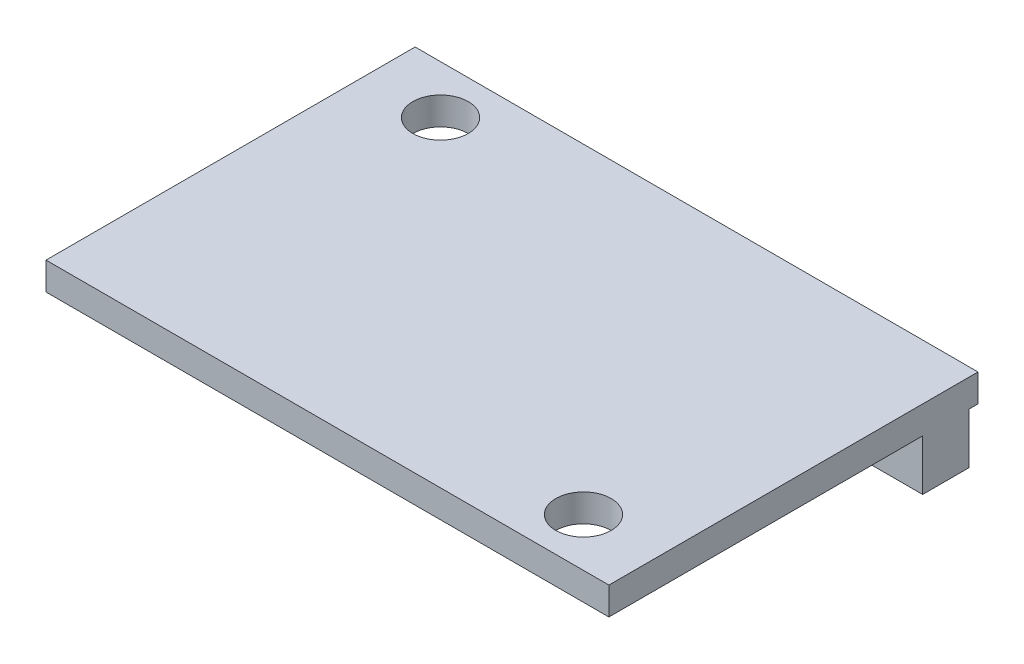
ISO-10303-21;
HEADER;
FILE_DESCRIPTION(('STEP AP214'),'2;1');
FILE_NAME('part.step','',(''),(''),'','','');
FILE_SCHEMA(('AUTOMOTIVE_DESIGN { 1 0 10303 214 1 1 1 1 }'));
ENDSEC;
DATA;
#1=APPLICATION_CONTEXT('core data for automotive mechanical design processes');
#2=APPLICATION_PROTOCOL_DEFINITION('international standard','automotive_design',2000,#1);
#3=PRODUCT_CONTEXT('',#1,'mechanical');
#4=PRODUCT('Part','Part','',(#3));
#5=PRODUCT_RELATED_PRODUCT_CATEGORY('part','',(#4));
#6=PRODUCT_DEFINITION_FORMATION('','',#4);
#7=PRODUCT_DEFINITION_CONTEXT('part definition',#1,'design');
#8=PRODUCT_DEFINITION('design','',#6,#7);
#9=PRODUCT_DEFINITION_SHAPE('','',#8);
#10=(LENGTH_UNIT() NAMED_UNIT(*) SI_UNIT(.MILLI.,.METRE.));
#11=(NAMED_UNIT(*) PLANE_ANGLE_UNIT() SI_UNIT($,.RADIAN.));
#12=(NAMED_UNIT(*) SI_UNIT($,.STERADIAN.) SOLID_ANGLE_UNIT());
#13=UNCERTAINTY_MEASURE_WITH_UNIT(LENGTH_MEASURE(1.E-05),#10,'distance_accuracy_value','');
#14=(GEOMETRIC_REPRESENTATION_CONTEXT(3) GLOBAL_UNCERTAINTY_ASSIGNED_CONTEXT((#13)) GLOBAL_UNIT_ASSIGNED_CONTEXT((#10,
#11,#12)) REPRESENTATION_CONTEXT('',''));
#15=CARTESIAN_POINT('',(0.,0.,0.));
#16=DIRECTION('',(0.,0.,1.));
#17=DIRECTION('',(1.,0.,0.));
#18=AXIS2_PLACEMENT_3D('',#15,#16,#17);
#19=CARTESIAN_POINT('',(0.,1.5,0.));
#20=DIRECTION('',(0.,-1.,0.));
#21=DIRECTION('',(0.,0.,-1.));
#22=AXIS2_PLACEMENT_3D('',#19,#20,#21);
#23=PLANE('',#22);
#24=DIRECTION('',(0.,0.,-1.));
#25=VECTOR('',#24,1.);
#26=CARTESIAN_POINT('',(15.25,1.5,10.));
#27=LINE('',#26,#25);
#28=CARTESIAN_POINT('',(15.25,1.5,10.));
#29=VERTEX_POINT('',#28);
#30=CARTESIAN_POINT('',(15.25,1.5,-10.));
#31=VERTEX_POINT('',#30);
#32=EDGE_CURVE('E151',#29,#31,#27,.T.);
#33=ORIENTED_EDGE('',*,*,#32,.T.);
#34=DIRECTION('',(-1.,0.,0.));
#35=VECTOR('',#34,1.);
#36=CARTESIAN_POINT('',(-15.25,1.5,-10.));
#37=LINE('',#36,#35);
#38=CARTESIAN_POINT('',(-15.25,1.5,-10.));
#39=VERTEX_POINT('',#38);
#40=EDGE_CURVE('E155',#31,#39,#37,.T.);
#41=ORIENTED_EDGE('',*,*,#40,.T.);
#42=DIRECTION('',(0.,0.,1.));
#43=VECTOR('',#42,1.);
#44=CARTESIAN_POINT('',(-15.25,1.5,10.));
#45=LINE('',#44,#43);
#46=CARTESIAN_POINT('',(-15.25,1.5,10.));
#47=VERTEX_POINT('',#46);
#48=EDGE_CURVE('E159',#39,#47,#45,.T.);
#49=ORIENTED_EDGE('',*,*,#48,.T.);
#50=DIRECTION('',(1.,0.,0.));
#51=VECTOR('',#50,1.);
#52=CARTESIAN_POINT('',(-15.25,1.5,10.));
#53=LINE('',#52,#51);
#54=EDGE_CURVE('E162',#47,#29,#53,.T.);
#55=ORIENTED_EDGE('',*,*,#54,.T.);
#56=EDGE_LOOP('',(#33,#41,#49,#55));
#57=FACE_BOUND('',#56,.T.);
#58=CARTESIAN_POINT('',(-11.25,1.5,-7.37704918032787));
#59=DIRECTION('',(0.,1.,0.));
#60=DIRECTION('',(0.,0.,1.));
#61=AXIS2_PLACEMENT_3D('',#58,#59,#60);
#62=CIRCLE('',#61,1.5);
#63=CARTESIAN_POINT('',(-11.25,1.5,-5.87704918032787));
#64=VERTEX_POINT('',#63);
#65=EDGE_CURVE('E143',#64,#64,#62,.T.);
#66=ORIENTED_EDGE('',*,*,#65,.F.);
#67=EDGE_LOOP('',(#66));
#68=FACE_BOUND('',#67,.T.);
#69=CARTESIAN_POINT('',(11.25,1.5,7.37704918032787));
#70=DIRECTION('',(0.,1.,0.));
#71=DIRECTION('',(0.,0.,1.));
#72=AXIS2_PLACEMENT_3D('',#69,#70,#71);
#73=CIRCLE('',#72,1.5);
#74=CARTESIAN_POINT('',(11.25,1.5,8.87704918032787));
#75=VERTEX_POINT('',#74);
#76=EDGE_CURVE('E133',#75,#75,#73,.T.);
#77=ORIENTED_EDGE('',*,*,#76,.F.);
#78=EDGE_LOOP('',(#77));
#79=FACE_BOUND('',#78,.T.);
#80=ADVANCED_FACE('F39',(#57,#68,#79),#23,.F.);
#81=CARTESIAN_POINT('',(0.,0.,0.));
#82=DIRECTION('',(0.,-1.,0.));
#83=DIRECTION('',(0.,0.,-1.));
#84=AXIS2_PLACEMENT_3D('',#81,#82,#83);
#85=PLANE('',#84);
#86=DIRECTION('',(-1.,0.,0.));
#87=VECTOR('',#86,1.);
#88=CARTESIAN_POINT('',(-6.75,0.,-7.));
#89=LINE('',#88,#87);
#90=CARTESIAN_POINT('',(15.25,0.,-7.));
#91=VERTEX_POINT('',#90);
#92=CARTESIAN_POINT('',(-6.75,0.,-7.));
#93=VERTEX_POINT('',#92);
#94=EDGE_CURVE('E124',#91,#93,#89,.T.);
#95=ORIENTED_EDGE('',*,*,#94,.F.);
#96=DIRECTION('',(0.,0.,-1.));
#97=VECTOR('',#96,1.);
#98=CARTESIAN_POINT('',(15.25,0.,10.));
#99=LINE('',#98,#97);
#100=CARTESIAN_POINT('',(15.25,0.,10.));
#101=VERTEX_POINT('',#100);
#102=EDGE_CURVE('E166',#101,#91,#99,.T.);
#103=ORIENTED_EDGE('',*,*,#102,.F.);
#104=DIRECTION('',(1.,0.,0.));
#105=VECTOR('',#104,1.);
#106=CARTESIAN_POINT('',(-15.25,0.,10.));
#107=LINE('',#106,#105);
#108=CARTESIAN_POINT('',(-15.25,0.,10.));
#109=VERTEX_POINT('',#108);
#110=EDGE_CURVE('E156',#109,#101,#107,.T.);
#111=ORIENTED_EDGE('',*,*,#110,.F.);
#112=DIRECTION('',(0.,0.,1.));
#113=VECTOR('',#112,1.);
#114=CARTESIAN_POINT('',(-15.25,0.,10.));
#115=LINE('',#114,#113);
#116=CARTESIAN_POINT('',(-15.25,0.,-10.));
#117=VERTEX_POINT('',#116);
#118=EDGE_CURVE('E173',#117,#109,#115,.T.);
#119=ORIENTED_EDGE('',*,*,#118,.F.);
#120=DIRECTION('',(-1.,0.,0.));
#121=VECTOR('',#120,1.);
#122=CARTESIAN_POINT('',(-15.25,0.,-10.));
#123=LINE('',#122,#121);
#124=CARTESIAN_POINT('',(15.25,0.,-10.));
#125=VERTEX_POINT('',#124);
#126=EDGE_CURVE('E170',#125,#117,#123,.T.);
#127=ORIENTED_EDGE('',*,*,#126,.F.);
#128=CARTESIAN_POINT('',(15.25,0.,-9.5));
#129=VERTEX_POINT('',#128);
#130=EDGE_CURVE('E147',#129,#125,#99,.T.);
#131=ORIENTED_EDGE('',*,*,#130,.F.);
#132=DIRECTION('',(1.,0.,0.));
#133=VECTOR('',#132,1.);
#134=CARTESIAN_POINT('',(-6.75,0.,-9.5));
#135=LINE('',#134,#133);
#136=CARTESIAN_POINT('',(-6.75,0.,-9.5));
#137=VERTEX_POINT('',#136);
#138=EDGE_CURVE('E60',#137,#129,#135,.T.);
#139=ORIENTED_EDGE('',*,*,#138,.F.);
#140=DIRECTION('',(0.,0.,-1.));
#141=VECTOR('',#140,1.);
#142=CARTESIAN_POINT('',(-6.75,0.,-7.));
#143=LINE('',#142,#141);
#144=EDGE_CURVE('E55',#93,#137,#143,.T.);
#145=ORIENTED_EDGE('',*,*,#144,.F.);
#146=EDGE_LOOP('',(#95,#103,#111,#119,#127,#131,#139,#145));
#147=FACE_BOUND('',#146,.T.);
#148=CARTESIAN_POINT('',(-11.25,0.,-7.37704918032787));
#149=DIRECTION('',(0.,1.,0.));
#150=DIRECTION('',(0.,0.,1.));
#151=AXIS2_PLACEMENT_3D('',#148,#149,#150);
#152=CIRCLE('',#151,1.5);
#153=CARTESIAN_POINT('',(-11.25,0.,-5.87704918032787));
#154=VERTEX_POINT('',#153);
#155=EDGE_CURVE('E141',#154,#154,#152,.T.);
#156=ORIENTED_EDGE('',*,*,#155,.T.);
#157=EDGE_LOOP('',(#156));
#158=FACE_BOUND('',#157,.T.);
#159=CARTESIAN_POINT('',(11.25,0.,7.37704918032787));
#160=DIRECTION('',(0.,1.,0.));
#161=DIRECTION('',(0.,0.,1.));
#162=AXIS2_PLACEMENT_3D('',#159,#160,#161);
#163=CIRCLE('',#162,1.5);
#164=CARTESIAN_POINT('',(11.25,0.,8.87704918032787));
#165=VERTEX_POINT('',#164);
#166=EDGE_CURVE('E128',#165,#165,#163,.T.);
#167=ORIENTED_EDGE('',*,*,#166,.T.);
#168=EDGE_LOOP('',(#167));
#169=FACE_BOUND('',#168,.T.);
#170=ADVANCED_FACE('F195',(#147,#158,#169),#85,.T.);
#171=CARTESIAN_POINT('',(15.25,1.5,10.));
#172=DIRECTION('',(-1.,0.,0.));
#173=DIRECTION('',(0.,0.,1.));
#174=AXIS2_PLACEMENT_3D('',#171,#172,#173);
#175=PLANE('',#174);
#176=ORIENTED_EDGE('',*,*,#102,.T.);
#177=DIRECTION('',(0.,1.,0.));
#178=VECTOR('',#177,1.);
#179=CARTESIAN_POINT('',(15.25,-2.75,-7.));
#180=LINE('',#179,#178);
#181=CARTESIAN_POINT('',(15.25,-2.75,-7.));
#182=VERTEX_POINT('',#181);
#183=EDGE_CURVE('E135',#182,#91,#180,.T.);
#184=ORIENTED_EDGE('',*,*,#183,.F.);
#185=DIRECTION('',(0.,0.,1.));
#186=VECTOR('',#185,1.);
#187=CARTESIAN_POINT('',(15.25,-2.75,-7.));
#188=LINE('',#187,#186);
#189=CARTESIAN_POINT('',(15.25,-2.75,-9.5));
#190=VERTEX_POINT('',#189);
#191=EDGE_CURVE('E113',#190,#182,#188,.T.);
#192=ORIENTED_EDGE('',*,*,#191,.F.);
#193=DIRECTION('',(0.,1.,0.));
#194=VECTOR('',#193,1.);
#195=CARTESIAN_POINT('',(15.25,-2.75,-9.5));
#196=LINE('',#195,#194);
#197=EDGE_CURVE('E109',#190,#129,#196,.T.);
#198=ORIENTED_EDGE('',*,*,#197,.T.);
#199=ORIENTED_EDGE('',*,*,#130,.T.);
#200=DIRECTION('',(0.,-1.,0.));
#201=VECTOR('',#200,1.);
#202=CARTESIAN_POINT('',(15.25,1.5,-10.));
#203=LINE('',#202,#201);
#204=EDGE_CURVE('E11',#31,#125,#203,.T.);
#205=ORIENTED_EDGE('',*,*,#204,.F.);
#206=ORIENTED_EDGE('',*,*,#32,.F.);
#207=DIRECTION('',(0.,-1.,0.));
#208=VECTOR('',#207,1.);
#209=CARTESIAN_POINT('',(15.25,1.5,10.));
#210=LINE('',#209,#208);
#211=EDGE_CURVE('E165',#29,#101,#210,.T.);
#212=ORIENTED_EDGE('',*,*,#211,.T.);
#213=EDGE_LOOP('',(#176,#184,#192,#198,#199,#205,#206,#212));
#214=FACE_BOUND('',#213,.T.);
#215=ADVANCED_FACE('F41',(#214),#175,.F.);
#216=CARTESIAN_POINT('',(-15.25,1.5,-10.));
#217=DIRECTION('',(0.,0.,1.));
#218=DIRECTION('',(1.,0.,0.));
#219=AXIS2_PLACEMENT_3D('',#216,#217,#218);
#220=PLANE('',#219);
#221=ORIENTED_EDGE('',*,*,#126,.T.);
#222=DIRECTION('',(0.,-1.,0.));
#223=VECTOR('',#222,1.);
#224=CARTESIAN_POINT('',(-15.25,1.5,-10.));
#225=LINE('',#224,#223);
#226=EDGE_CURVE('E48',#39,#117,#225,.T.);
#227=ORIENTED_EDGE('',*,*,#226,.F.);
#228=ORIENTED_EDGE('',*,*,#40,.F.);
#229=ORIENTED_EDGE('',*,*,#204,.T.);
#230=EDGE_LOOP('',(#221,#227,#228,#229));
#231=FACE_BOUND('',#230,.T.);
#232=ADVANCED_FACE('F209',(#231),#220,.F.);
#233=CARTESIAN_POINT('',(-15.25,1.5,10.));
#234=DIRECTION('',(1.,0.,0.));
#235=DIRECTION('',(0.,0.,-1.));
#236=AXIS2_PLACEMENT_3D('',#233,#234,#235);
#237=PLANE('',#236);
#238=ORIENTED_EDGE('',*,*,#118,.T.);
#239=DIRECTION('',(0.,-1.,0.));
#240=VECTOR('',#239,1.);
#241=CARTESIAN_POINT('',(-15.25,1.5,10.));
#242=LINE('',#241,#240);
#243=EDGE_CURVE('E181',#47,#109,#242,.T.);
#244=ORIENTED_EDGE('',*,*,#243,.F.);
#245=ORIENTED_EDGE('',*,*,#48,.F.);
#246=ORIENTED_EDGE('',*,*,#226,.T.);
#247=EDGE_LOOP('',(#238,#244,#245,#246));
#248=FACE_BOUND('',#247,.T.);
#249=ADVANCED_FACE('F190',(#248),#237,.F.);
#250=CARTESIAN_POINT('',(-15.25,1.5,10.));
#251=DIRECTION('',(0.,0.,-1.));
#252=DIRECTION('',(-1.,0.,0.));
#253=AXIS2_PLACEMENT_3D('',#250,#251,#252);
#254=PLANE('',#253);
#255=ORIENTED_EDGE('',*,*,#110,.T.);
#256=ORIENTED_EDGE('',*,*,#211,.F.);
#257=ORIENTED_EDGE('',*,*,#54,.F.);
#258=ORIENTED_EDGE('',*,*,#243,.T.);
#259=EDGE_LOOP('',(#255,#256,#257,#258));
#260=FACE_BOUND('',#259,.T.);
#261=ADVANCED_FACE('F200',(#260),#254,.F.);
#262=CARTESIAN_POINT('',(-11.25,1.5,-7.37704918032787));
#263=DIRECTION('',(0.,-1.,0.));
#264=DIRECTION('',(0.,0.,-1.));
#265=AXIS2_PLACEMENT_3D('',#262,#263,#264);
#266=CYLINDRICAL_SURFACE('',#265,1.5);
#267=ORIENTED_EDGE('',*,*,#65,.T.);
#268=EDGE_LOOP('',(#267));
#269=FACE_BOUND('',#268,.T.);
#270=ORIENTED_EDGE('',*,*,#155,.F.);
#271=EDGE_LOOP('',(#270));
#272=FACE_BOUND('',#271,.T.);
#273=ADVANCED_FACE('F223',(#269,#272),#266,.F.);
#274=CARTESIAN_POINT('',(11.25,1.5,7.37704918032787));
#275=DIRECTION('',(0.,-1.,0.));
#276=DIRECTION('',(0.,0.,-1.));
#277=AXIS2_PLACEMENT_3D('',#274,#275,#276);
#278=CYLINDRICAL_SURFACE('',#277,1.5);
#279=ORIENTED_EDGE('',*,*,#76,.T.);
#280=EDGE_LOOP('',(#279));
#281=FACE_BOUND('',#280,.T.);
#282=ORIENTED_EDGE('',*,*,#166,.F.);
#283=EDGE_LOOP('',(#282));
#284=FACE_BOUND('',#283,.T.);
#285=ADVANCED_FACE('F230',(#281,#284),#278,.F.);
#286=CARTESIAN_POINT('',(-6.75,-2.75,-7.));
#287=DIRECTION('',(1.,0.,0.));
#288=DIRECTION('',(0.,0.,-1.));
#289=AXIS2_PLACEMENT_3D('',#286,#287,#288);
#290=PLANE('',#289);
#291=ORIENTED_EDGE('',*,*,#144,.T.);
#292=DIRECTION('',(0.,1.,0.));
#293=VECTOR('',#292,1.);
#294=CARTESIAN_POINT('',(-6.75,-2.75,-9.5));
#295=LINE('',#294,#293);
#296=CARTESIAN_POINT('',(-6.75,-2.75,-9.5));
#297=VERTEX_POINT('',#296);
#298=EDGE_CURVE('E107',#297,#137,#295,.T.);
#299=ORIENTED_EDGE('',*,*,#298,.F.);
#300=DIRECTION('',(0.,0.,-1.));
#301=VECTOR('',#300,1.);
#302=CARTESIAN_POINT('',(-6.75,-2.75,-7.));
#303=LINE('',#302,#301);
#304=CARTESIAN_POINT('',(-6.75,-2.75,-7.));
#305=VERTEX_POINT('',#304);
#306=EDGE_CURVE('E114',#305,#297,#303,.T.);
#307=ORIENTED_EDGE('',*,*,#306,.F.);
#308=DIRECTION('',(0.,1.,0.));
#309=VECTOR('',#308,1.);
#310=CARTESIAN_POINT('',(-6.75,-2.75,-7.));
#311=LINE('',#310,#309);
#312=EDGE_CURVE('E321',#305,#93,#311,.T.);
#313=ORIENTED_EDGE('',*,*,#312,.T.);
#314=EDGE_LOOP('',(#291,#299,#307,#313));
#315=FACE_BOUND('',#314,.T.);
#316=ADVANCED_FACE('F126',(#315),#290,.F.);
#317=CARTESIAN_POINT('',(-6.75,-2.75,-9.5));
#318=DIRECTION('',(0.,0.,1.));
#319=DIRECTION('',(1.,0.,0.));
#320=AXIS2_PLACEMENT_3D('',#317,#318,#319);
#321=PLANE('',#320);
#322=ORIENTED_EDGE('',*,*,#138,.T.);
#323=ORIENTED_EDGE('',*,*,#197,.F.);
#324=DIRECTION('',(1.,0.,0.));
#325=VECTOR('',#324,1.);
#326=CARTESIAN_POINT('',(-6.75,-2.75,-9.5));
#327=LINE('',#326,#325);
#328=EDGE_CURVE('E103',#297,#190,#327,.T.);
#329=ORIENTED_EDGE('',*,*,#328,.F.);
#330=ORIENTED_EDGE('',*,*,#298,.T.);
#331=EDGE_LOOP('',(#322,#323,#329,#330));
#332=FACE_BOUND('',#331,.T.);
#333=ADVANCED_FACE('F105',(#332),#321,.F.);
#334=CARTESIAN_POINT('',(-6.75,-2.75,-7.));
#335=DIRECTION('',(0.,0.,-1.));
#336=DIRECTION('',(-1.,0.,0.));
#337=AXIS2_PLACEMENT_3D('',#334,#335,#336);
#338=PLANE('',#337);
#339=ORIENTED_EDGE('',*,*,#94,.T.);
#340=ORIENTED_EDGE('',*,*,#312,.F.);
#341=DIRECTION('',(-1.,0.,0.));
#342=VECTOR('',#341,1.);
#343=CARTESIAN_POINT('',(-6.75,-2.75,-7.));
#344=LINE('',#343,#342);
#345=EDGE_CURVE('E119',#182,#305,#344,.T.);
#346=ORIENTED_EDGE('',*,*,#345,.F.);
#347=ORIENTED_EDGE('',*,*,#183,.T.);
#348=EDGE_LOOP('',(#339,#340,#346,#347));
#349=FACE_BOUND('',#348,.T.);
#350=ADVANCED_FACE('F251',(#349),#338,.F.);
#351=CARTESIAN_POINT('',(0.,-2.75,0.));
#352=DIRECTION('',(0.,-1.,0.));
#353=DIRECTION('',(0.,0.,-1.));
#354=AXIS2_PLACEMENT_3D('',#351,#352,#353);
#355=PLANE('',#354);
#356=ORIENTED_EDGE('',*,*,#306,.T.);
#357=ORIENTED_EDGE('',*,*,#328,.T.);
#358=ORIENTED_EDGE('',*,*,#191,.T.);
#359=ORIENTED_EDGE('',*,*,#345,.T.);
#360=EDGE_LOOP('',(#356,#357,#358,#359));
#361=FACE_BOUND('',#360,.T.);
#362=ADVANCED_FACE('F117',(#361),#355,.T.);
#363=CLOSED_SHELL('',(#80,#170,#215,#232,#249,#261,#273,#285,#316,#333,#350,#362));
#364=MANIFOLD_SOLID_BREP('B2',#363);
#365=ADVANCED_BREP_SHAPE_REPRESENTATION('',(#18,#364),#14);
#366=SHAPE_DEFINITION_REPRESENTATION(#9,#365);
ENDSEC;
END-ISO-10303-21;
